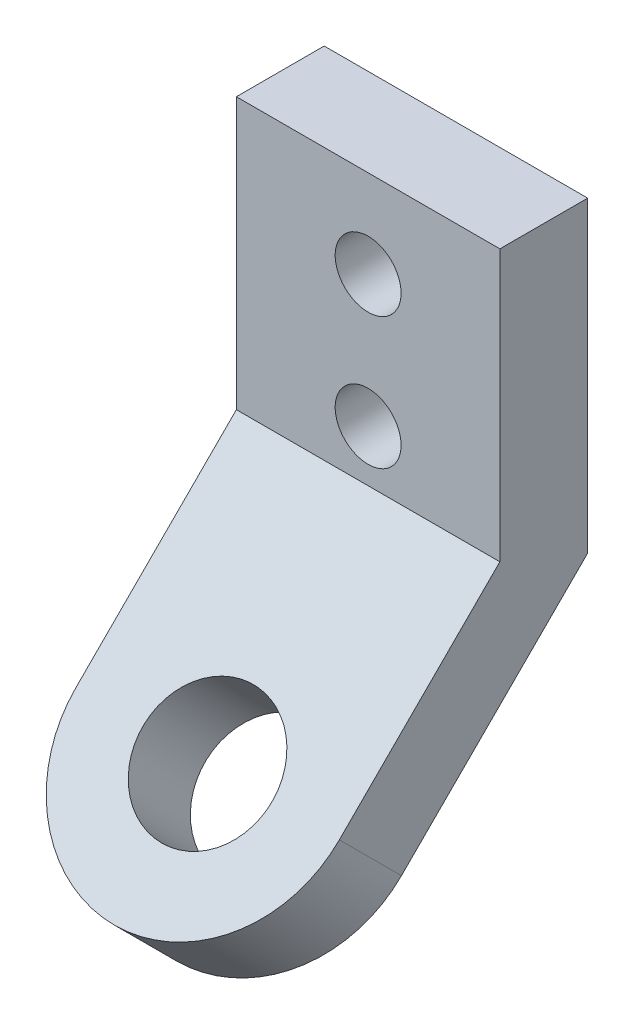
ISO-10303-21;
HEADER;
FILE_DESCRIPTION(('STEP AP214'),'2;1');
FILE_NAME('part.step','',(''),(''),'','','');
FILE_SCHEMA(('AUTOMOTIVE_DESIGN { 1 0 10303 214 1 1 1 1 }'));
ENDSEC;
DATA;
#1=APPLICATION_CONTEXT('core data for automotive mechanical design processes');
#2=APPLICATION_PROTOCOL_DEFINITION('international standard','automotive_design',2000,#1);
#3=PRODUCT_CONTEXT('',#1,'mechanical');
#4=PRODUCT('Part','Part','',(#3));
#5=PRODUCT_RELATED_PRODUCT_CATEGORY('part','',(#4));
#6=PRODUCT_DEFINITION_FORMATION('','',#4);
#7=PRODUCT_DEFINITION_CONTEXT('part definition',#1,'design');
#8=PRODUCT_DEFINITION('design','',#6,#7);
#9=PRODUCT_DEFINITION_SHAPE('','',#8);
#10=(LENGTH_UNIT() NAMED_UNIT(*) SI_UNIT(.MILLI.,.METRE.));
#11=(NAMED_UNIT(*) PLANE_ANGLE_UNIT() SI_UNIT($,.RADIAN.));
#12=(NAMED_UNIT(*) SI_UNIT($,.STERADIAN.) SOLID_ANGLE_UNIT());
#13=UNCERTAINTY_MEASURE_WITH_UNIT(LENGTH_MEASURE(1.E-05),#10,'distance_accuracy_value','');
#14=(GEOMETRIC_REPRESENTATION_CONTEXT(3) GLOBAL_UNCERTAINTY_ASSIGNED_CONTEXT((#13)) GLOBAL_UNIT_ASSIGNED_CONTEXT((#10,
#11,#12)) REPRESENTATION_CONTEXT('',''));
#15=CARTESIAN_POINT('',(0.,0.,0.));
#16=DIRECTION('',(0.,0.,1.));
#17=DIRECTION('',(1.,0.,0.));
#18=AXIS2_PLACEMENT_3D('',#15,#16,#17);
#19=CARTESIAN_POINT('',(76.2,-161.616360533993,161.616360533994));
#20=DIRECTION('',(0.,0.707106781186549,0.707106781186546));
#21=DIRECTION('',(0.,-0.707106781186546,0.707106781186549));
#22=AXIS2_PLACEMENT_3D('',#19,#20,#21);
#23=PLANE('',#22);
#24=DIRECTION('',(0.,0.707106781186546,-0.707106781186549));
#25=VECTOR('',#24,1.);
#26=CARTESIAN_POINT('',(-76.2,-161.616360533993,161.616360533994));
#27=LINE('',#26,#25);
#28=CARTESIAN_POINT('',(-76.2,-107.734823807578,107.734823807579));
#29=VERTEX_POINT('',#28);
#30=CARTESIAN_POINT('',(-76.2,0.,0.));
#31=VERTEX_POINT('',#30);
#32=EDGE_CURVE('E125',#29,#31,#27,.T.);
#33=ORIENTED_EDGE('',*,*,#32,.T.);
#34=DIRECTION('',(-1.,0.,0.));
#35=VECTOR('',#34,1.);
#36=CARTESIAN_POINT('',(76.2,0.,0.));
#37=LINE('',#36,#35);
#38=CARTESIAN_POINT('',(76.2,0.,0.));
#39=VERTEX_POINT('',#38);
#40=EDGE_CURVE('E163',#39,#31,#37,.T.);
#41=ORIENTED_EDGE('',*,*,#40,.F.);
#42=DIRECTION('',(0.,0.707106781186546,-0.707106781186549));
#43=VECTOR('',#42,1.);
#44=CARTESIAN_POINT('',(76.2,-161.616360533993,161.616360533994));
#45=LINE('',#44,#43);
#46=CARTESIAN_POINT('',(76.2,-107.734823807578,107.734823807579));
#47=VERTEX_POINT('',#46);
#48=EDGE_CURVE('E150',#47,#39,#45,.T.);
#49=ORIENTED_EDGE('',*,*,#48,.F.);
#50=CARTESIAN_POINT('',(0.,-107.734823807578,107.734823807579));
#51=DIRECTION('',(0.,0.707106781186549,0.707106781186546));
#52=DIRECTION('',(0.,-0.707106781186546,0.707106781186549));
#53=AXIS2_PLACEMENT_3D('',#50,#51,#52);
#54=CIRCLE('',#53,76.2);
#55=EDGE_CURVE('E145',#29,#47,#54,.T.);
#56=ORIENTED_EDGE('',*,*,#55,.F.);
#57=EDGE_LOOP('',(#33,#41,#49,#56));
#58=FACE_BOUND('',#57,.T.);
#59=CARTESIAN_POINT('',(0.,-107.734823807578,107.734823807579));
#60=DIRECTION('',(0.,0.707106781186549,0.707106781186546));
#61=DIRECTION('',(0.,-0.707106781186546,0.707106781186549));
#62=AXIS2_PLACEMENT_3D('',#59,#60,#61);
#63=CIRCLE('',#62,37.465);
#64=CARTESIAN_POINT('',(0.,-134.226579364732,134.226579364733));
#65=VERTEX_POINT('',#64);
#66=EDGE_CURVE('E147',#65,#65,#63,.T.);
#67=ORIENTED_EDGE('',*,*,#66,.T.);
#68=EDGE_LOOP('',(#67));
#69=FACE_BOUND('',#68,.T.);
#70=ADVANCED_FACE('F54',(#58,#69),#23,.F.);
#71=CARTESIAN_POINT('',(76.2,21.0420489685534,50.8));
#72=DIRECTION('',(0.,-0.707106781186549,-0.707106781186546));
#73=DIRECTION('',(0.,0.707106781186546,-0.707106781186549));
#74=AXIS2_PLACEMENT_3D('',#71,#72,#73);
#75=PLANE('',#74);
#76=CARTESIAN_POINT('',(0.,-71.8137993233015,143.655848291855));
#77=DIRECTION('',(0.,0.707106781186549,0.707106781186546));
#78=DIRECTION('',(0.,-0.707106781186546,0.707106781186549));
#79=AXIS2_PLACEMENT_3D('',#76,#77,#78);
#80=CIRCLE('',#79,37.465);
#81=CARTESIAN_POINT('',(0.,-98.3055548804554,170.147603849009));
#82=VERTEX_POINT('',#81);
#83=EDGE_CURVE('E116',#82,#82,#80,.T.);
#84=ORIENTED_EDGE('',*,*,#83,.F.);
#85=EDGE_LOOP('',(#84));
#86=FACE_BOUND('',#85,.T.);
#87=DIRECTION('',(-1.,0.,0.));
#88=VECTOR('',#87,1.);
#89=CARTESIAN_POINT('',(76.2,21.0420489685534,50.8));
#90=LINE('',#89,#88);
#91=CARTESIAN_POINT('',(76.2,21.0420489685534,50.8));
#92=VERTEX_POINT('',#91);
#93=CARTESIAN_POINT('',(-76.2,21.0420489685534,50.8));
#94=VERTEX_POINT('',#93);
#95=EDGE_CURVE('E128',#92,#94,#90,.T.);
#96=ORIENTED_EDGE('',*,*,#95,.T.);
#97=DIRECTION('',(0.,-0.707106781186546,0.707106781186549));
#98=VECTOR('',#97,1.);
#99=CARTESIAN_POINT('',(-76.2,21.0420489685534,50.8));
#100=LINE('',#99,#98);
#101=CARTESIAN_POINT('',(-76.2,-71.8137993233015,143.655848291855));
#102=VERTEX_POINT('',#101);
#103=EDGE_CURVE('E122',#94,#102,#100,.T.);
#104=ORIENTED_EDGE('',*,*,#103,.T.);
#105=CARTESIAN_POINT('',(0.,-71.8137993233015,143.655848291855));
#106=DIRECTION('',(0.,0.707106781186549,0.707106781186546));
#107=DIRECTION('',(0.,-0.707106781186546,0.707106781186549));
#108=AXIS2_PLACEMENT_3D('',#105,#106,#107);
#109=CIRCLE('',#108,76.2);
#110=CARTESIAN_POINT('',(76.2,-71.8137993233015,143.655848291855));
#111=VERTEX_POINT('',#110);
#112=EDGE_CURVE('E106',#102,#111,#109,.T.);
#113=ORIENTED_EDGE('',*,*,#112,.T.);
#114=DIRECTION('',(0.,-0.707106781186546,0.707106781186549));
#115=VECTOR('',#114,1.);
#116=CARTESIAN_POINT('',(76.2,21.0420489685534,50.8));
#117=LINE('',#116,#115);
#118=EDGE_CURVE('E156',#92,#111,#117,.T.);
#119=ORIENTED_EDGE('',*,*,#118,.F.);
#120=EDGE_LOOP('',(#96,#104,#113,#119));
#121=FACE_BOUND('',#120,.T.);
#122=ADVANCED_FACE('F127',(#86,#121),#75,.F.);
#123=CARTESIAN_POINT('',(76.2,0.,0.));
#124=DIRECTION('',(0.,0.,1.));
#125=DIRECTION('',(1.,0.,0.));
#126=AXIS2_PLACEMENT_3D('',#123,#124,#125);
#127=PLANE('',#126);
#128=DIRECTION('',(0.,1.,0.));
#129=VECTOR('',#128,1.);
#130=CARTESIAN_POINT('',(-76.2,0.,0.));
#131=LINE('',#130,#129);
#132=CARTESIAN_POINT('',(-76.2,177.8,0.));
#133=VERTEX_POINT('',#132);
#134=EDGE_CURVE('E311',#31,#133,#131,.T.);
#135=ORIENTED_EDGE('',*,*,#134,.T.);
#136=DIRECTION('',(-1.,0.,0.));
#137=VECTOR('',#136,1.);
#138=CARTESIAN_POINT('',(76.2,177.8,0.));
#139=LINE('',#138,#137);
#140=CARTESIAN_POINT('',(76.2,177.8,0.));
#141=VERTEX_POINT('',#140);
#142=EDGE_CURVE('E161',#141,#133,#139,.T.);
#143=ORIENTED_EDGE('',*,*,#142,.F.);
#144=DIRECTION('',(0.,1.,0.));
#145=VECTOR('',#144,1.);
#146=CARTESIAN_POINT('',(76.2,0.,0.));
#147=LINE('',#146,#145);
#148=EDGE_CURVE('E152',#39,#141,#147,.T.);
#149=ORIENTED_EDGE('',*,*,#148,.F.);
#150=ORIENTED_EDGE('',*,*,#40,.T.);
#151=EDGE_LOOP('',(#135,#143,#149,#150));
#152=FACE_BOUND('',#151,.T.);
#153=CARTESIAN_POINT('',(0.,127.,0.));
#154=DIRECTION('',(0.,0.,1.));
#155=DIRECTION('',(1.,0.,0.));
#156=AXIS2_PLACEMENT_3D('',#153,#154,#155);
#157=CIRCLE('',#156,19.05);
#158=CARTESIAN_POINT('',(19.05,127.,0.));
#159=VERTEX_POINT('',#158);
#160=EDGE_CURVE('E134',#159,#159,#157,.T.);
#161=ORIENTED_EDGE('',*,*,#160,.T.);
#162=EDGE_LOOP('',(#161));
#163=FACE_BOUND('',#162,.T.);
#164=CARTESIAN_POINT('',(0.,50.8,0.));
#165=DIRECTION('',(0.,0.,1.));
#166=DIRECTION('',(1.,0.,0.));
#167=AXIS2_PLACEMENT_3D('',#164,#165,#166);
#168=CIRCLE('',#167,19.05);
#169=CARTESIAN_POINT('',(19.05,50.8,0.));
#170=VERTEX_POINT('',#169);
#171=EDGE_CURVE('E130',#170,#170,#168,.T.);
#172=ORIENTED_EDGE('',*,*,#171,.T.);
#173=EDGE_LOOP('',(#172));
#174=FACE_BOUND('',#173,.T.);
#175=ADVANCED_FACE('F178',(#152,#163,#174),#127,.F.);
#176=CARTESIAN_POINT('',(76.2,177.8,0.));
#177=DIRECTION('',(0.,-1.,0.));
#178=DIRECTION('',(0.,0.,-1.));
#179=AXIS2_PLACEMENT_3D('',#176,#177,#178);
#180=PLANE('',#179);
#181=ORIENTED_EDGE('',*,*,#142,.T.);
#182=DIRECTION('',(0.,0.,1.));
#183=VECTOR('',#182,1.);
#184=CARTESIAN_POINT('',(-76.2,177.8,0.));
#185=LINE('',#184,#183);
#186=CARTESIAN_POINT('',(-76.2,177.8,50.8));
#187=VERTEX_POINT('',#186);
#188=EDGE_CURVE('E136',#133,#187,#185,.T.);
#189=ORIENTED_EDGE('',*,*,#188,.T.);
#190=DIRECTION('',(-1.,0.,0.));
#191=VECTOR('',#190,1.);
#192=CARTESIAN_POINT('',(76.2,177.8,50.8));
#193=LINE('',#192,#191);
#194=CARTESIAN_POINT('',(76.2,177.8,50.8));
#195=VERTEX_POINT('',#194);
#196=EDGE_CURVE('E159',#195,#187,#193,.T.);
#197=ORIENTED_EDGE('',*,*,#196,.F.);
#198=DIRECTION('',(0.,0.,1.));
#199=VECTOR('',#198,1.);
#200=CARTESIAN_POINT('',(76.2,177.8,0.));
#201=LINE('',#200,#199);
#202=EDGE_CURVE('E73',#141,#195,#201,.T.);
#203=ORIENTED_EDGE('',*,*,#202,.F.);
#204=EDGE_LOOP('',(#181,#189,#197,#203));
#205=FACE_BOUND('',#204,.T.);
#206=ADVANCED_FACE('F180',(#205),#180,.F.);
#207=CARTESIAN_POINT('',(76.2,177.8,50.8));
#208=DIRECTION('',(0.,0.,-1.));
#209=DIRECTION('',(0.,1.,0.));
#210=AXIS2_PLACEMENT_3D('',#207,#208,#209);
#211=PLANE('',#210);
#212=CARTESIAN_POINT('',(0.,127.,50.8));
#213=DIRECTION('',(0.,0.,-1.));
#214=DIRECTION('',(0.,1.,0.));
#215=AXIS2_PLACEMENT_3D('',#212,#213,#214);
#216=CIRCLE('',#215,19.05);
#217=CARTESIAN_POINT('',(19.05,127.,50.8));
#218=VERTEX_POINT('',#217);
#219=EDGE_CURVE('E12',#218,#218,#216,.T.);
#220=ORIENTED_EDGE('',*,*,#219,.T.);
#221=EDGE_LOOP('',(#220));
#222=FACE_BOUND('',#221,.T.);
#223=CARTESIAN_POINT('',(0.,50.8,50.8));
#224=DIRECTION('',(0.,0.,-1.));
#225=DIRECTION('',(0.,1.,0.));
#226=AXIS2_PLACEMENT_3D('',#223,#224,#225);
#227=CIRCLE('',#226,19.05);
#228=CARTESIAN_POINT('',(19.05,50.8,50.8));
#229=VERTEX_POINT('',#228);
#230=EDGE_CURVE('E61',#229,#229,#227,.T.);
#231=ORIENTED_EDGE('',*,*,#230,.T.);
#232=EDGE_LOOP('',(#231));
#233=FACE_BOUND('',#232,.T.);
#234=ORIENTED_EDGE('',*,*,#196,.T.);
#235=DIRECTION('',(0.,-1.,0.));
#236=VECTOR('',#235,1.);
#237=CARTESIAN_POINT('',(-76.2,177.8,50.8));
#238=LINE('',#237,#236);
#239=EDGE_CURVE('E131',#187,#94,#238,.T.);
#240=ORIENTED_EDGE('',*,*,#239,.T.);
#241=ORIENTED_EDGE('',*,*,#95,.F.);
#242=DIRECTION('',(0.,-1.,0.));
#243=VECTOR('',#242,1.);
#244=CARTESIAN_POINT('',(76.2,177.8,50.8));
#245=LINE('',#244,#243);
#246=EDGE_CURVE('E68',#195,#92,#245,.T.);
#247=ORIENTED_EDGE('',*,*,#246,.F.);
#248=EDGE_LOOP('',(#234,#240,#241,#247));
#249=FACE_BOUND('',#248,.T.);
#250=ADVANCED_FACE('F167',(#222,#233,#249),#211,.F.);
#251=CARTESIAN_POINT('',(76.2,0.,0.));
#252=DIRECTION('',(1.,0.,0.));
#253=DIRECTION('',(0.,0.,-1.));
#254=AXIS2_PLACEMENT_3D('',#251,#252,#253);
#255=PLANE('',#254);
#256=DIRECTION('',(0.,0.707106781186549,0.707106781186546));
#257=VECTOR('',#256,1.);
#258=CARTESIAN_POINT('',(76.2,-188.543004074575,26.9266435405821));
#259=LINE('',#258,#257);
#260=EDGE_CURVE('E112',#47,#111,#259,.T.);
#261=ORIENTED_EDGE('',*,*,#260,.F.);
#262=ORIENTED_EDGE('',*,*,#48,.T.);
#263=ORIENTED_EDGE('',*,*,#148,.T.);
#264=ORIENTED_EDGE('',*,*,#202,.T.);
#265=ORIENTED_EDGE('',*,*,#246,.T.);
#266=ORIENTED_EDGE('',*,*,#118,.T.);
#267=EDGE_LOOP('',(#261,#262,#263,#264,#265,#266));
#268=FACE_BOUND('',#267,.T.);
#269=ADVANCED_FACE('F207',(#268),#255,.T.);
#270=CARTESIAN_POINT('',(0.,-188.543004074575,26.9266435405821));
#271=DIRECTION('',(0.,0.707106781186549,0.707106781186546));
#272=DIRECTION('',(0.,-0.707106781186546,0.707106781186549));
#273=AXIS2_PLACEMENT_3D('',#270,#271,#272);
#274=CYLINDRICAL_SURFACE('',#273,76.2);
#275=ORIENTED_EDGE('',*,*,#55,.T.);
#276=ORIENTED_EDGE('',*,*,#260,.T.);
#277=ORIENTED_EDGE('',*,*,#112,.F.);
#278=DIRECTION('',(0.,0.707106781186549,0.707106781186546));
#279=VECTOR('',#278,1.);
#280=CARTESIAN_POINT('',(-76.2,-188.543004074575,26.9266435405821));
#281=LINE('',#280,#279);
#282=EDGE_CURVE('E109',#29,#102,#281,.T.);
#283=ORIENTED_EDGE('',*,*,#282,.F.);
#284=EDGE_LOOP('',(#275,#276,#277,#283));
#285=FACE_BOUND('',#284,.T.);
#286=ADVANCED_FACE('F108',(#285),#274,.T.);
#287=CARTESIAN_POINT('',(0.,-188.543004074575,26.9266435405821));
#288=DIRECTION('',(0.,0.707106781186549,0.707106781186546));
#289=DIRECTION('',(0.,-0.707106781186546,0.707106781186549));
#290=AXIS2_PLACEMENT_3D('',#287,#288,#289);
#291=CYLINDRICAL_SURFACE('',#290,37.465);
#292=ORIENTED_EDGE('',*,*,#83,.T.);
#293=EDGE_LOOP('',(#292));
#294=FACE_BOUND('',#293,.T.);
#295=ORIENTED_EDGE('',*,*,#66,.F.);
#296=EDGE_LOOP('',(#295));
#297=FACE_BOUND('',#296,.T.);
#298=ADVANCED_FACE('F174',(#294,#297),#291,.F.);
#299=CARTESIAN_POINT('',(0.,50.8,0.));
#300=DIRECTION('',(0.,0.,1.));
#301=DIRECTION('',(1.,0.,0.));
#302=AXIS2_PLACEMENT_3D('',#299,#300,#301);
#303=CYLINDRICAL_SURFACE('',#302,19.05);
#304=CARTESIAN_POINT('',(19.05,50.8,50.8));
#305=CARTESIAN_POINT('',(19.05,50.8,50.2708333333333));
#306=CARTESIAN_POINT('',(19.05,50.8,49.7416666666667));
#307=CARTESIAN_POINT('',(19.05,50.8,48.6833333333333));
#308=CARTESIAN_POINT('',(19.05,50.8,48.1541666666667));
#309=CARTESIAN_POINT('',(19.05,50.8,47.0958333333333));
#310=CARTESIAN_POINT('',(19.05,50.8,46.5666666666667));
#311=CARTESIAN_POINT('',(19.05,50.8,45.5083333333333));
#312=CARTESIAN_POINT('',(19.05,50.8,44.9791666666667));
#313=CARTESIAN_POINT('',(19.05,50.8,43.9208333333333));
#314=CARTESIAN_POINT('',(19.05,50.8,43.3916666666667));
#315=CARTESIAN_POINT('',(19.05,50.8,42.3333333333333));
#316=CARTESIAN_POINT('',(19.05,50.8,41.8041666666667));
#317=CARTESIAN_POINT('',(19.05,50.8,40.7458333333333));
#318=CARTESIAN_POINT('',(19.05,50.8,40.2166666666667));
#319=CARTESIAN_POINT('',(19.05,50.8,39.1583333333333));
#320=CARTESIAN_POINT('',(19.05,50.8,38.6291666666667));
#321=CARTESIAN_POINT('',(19.05,50.8,37.5708333333333));
#322=CARTESIAN_POINT('',(19.05,50.8,37.0416666666667));
#323=CARTESIAN_POINT('',(19.05,50.8,35.9833333333333));
#324=CARTESIAN_POINT('',(19.05,50.8,35.4541666666667));
#325=CARTESIAN_POINT('',(19.05,50.8,34.3958333333333));
#326=CARTESIAN_POINT('',(19.05,50.8,33.8666666666667));
#327=CARTESIAN_POINT('',(19.05,50.8,32.8083333333333));
#328=CARTESIAN_POINT('',(19.05,50.8,32.2791666666667));
#329=CARTESIAN_POINT('',(19.05,50.8,31.2208333333333));
#330=CARTESIAN_POINT('',(19.05,50.8,30.6916666666667));
#331=CARTESIAN_POINT('',(19.05,50.8,29.6333333333333));
#332=CARTESIAN_POINT('',(19.05,50.8,29.1041666666667));
#333=CARTESIAN_POINT('',(19.05,50.8,28.0458333333333));
#334=CARTESIAN_POINT('',(19.05,50.8,27.5166666666667));
#335=CARTESIAN_POINT('',(19.05,50.8,26.4583333333333));
#336=CARTESIAN_POINT('',(19.05,50.8,25.9291666666667));
#337=CARTESIAN_POINT('',(19.05,50.8,24.8708333333333));
#338=CARTESIAN_POINT('',(19.05,50.8,24.3416666666667));
#339=CARTESIAN_POINT('',(19.05,50.8,23.2833333333333));
#340=CARTESIAN_POINT('',(19.05,50.8,22.7541666666667));
#341=CARTESIAN_POINT('',(19.05,50.8,21.6958333333333));
#342=CARTESIAN_POINT('',(19.05,50.8,21.1666666666667));
#343=CARTESIAN_POINT('',(19.05,50.8,20.1083333333333));
#344=CARTESIAN_POINT('',(19.05,50.8,19.5791666666667));
#345=CARTESIAN_POINT('',(19.05,50.8,18.5208333333333));
#346=CARTESIAN_POINT('',(19.05,50.8,17.9916666666667));
#347=CARTESIAN_POINT('',(19.05,50.8,16.9333333333333));
#348=CARTESIAN_POINT('',(19.05,50.8,16.4041666666667));
#349=CARTESIAN_POINT('',(19.05,50.8,15.3458333333333));
#350=CARTESIAN_POINT('',(19.05,50.8,14.8166666666667));
#351=CARTESIAN_POINT('',(19.05,50.8,13.7583333333333));
#352=CARTESIAN_POINT('',(19.05,50.8,13.2291666666667));
#353=CARTESIAN_POINT('',(19.05,50.8,12.1708333333333));
#354=CARTESIAN_POINT('',(19.05,50.8,11.6416666666667));
#355=CARTESIAN_POINT('',(19.05,50.8,10.5833333333333));
#356=CARTESIAN_POINT('',(19.05,50.8,10.0541666666667));
#357=CARTESIAN_POINT('',(19.05,50.8,8.99583333333333));
#358=CARTESIAN_POINT('',(19.05,50.8,8.46666666666666));
#359=CARTESIAN_POINT('',(19.05,50.8,7.40833333333333));
#360=CARTESIAN_POINT('',(19.05,50.8,6.87916666666667));
#361=CARTESIAN_POINT('',(19.05,50.8,5.82083333333333));
#362=CARTESIAN_POINT('',(19.05,50.8,5.29166666666667));
#363=CARTESIAN_POINT('',(19.05,50.8,4.23333333333333));
#364=CARTESIAN_POINT('',(19.05,50.8,3.70416666666667));
#365=CARTESIAN_POINT('',(19.05,50.8,2.64583333333333));
#366=CARTESIAN_POINT('',(19.05,50.8,2.11666666666666));
#367=CARTESIAN_POINT('',(19.05,50.8,1.05833333333333));
#368=CARTESIAN_POINT('',(19.05,50.8,0.529166666666666));
#369=CARTESIAN_POINT('',(19.05,50.8,0.));
#370=B_SPLINE_CURVE_WITH_KNOTS('',3,(#304,#305,#306,#307,#308,#309,#310,#311,#312,#313,#314,
#315,#316,#317,#318,#319,#320,#321,#322,#323,#324,#325,#326,#327,#328,#329,#330,#331,#332,#333,
#334,#335,#336,#337,#338,#339,#340,#341,#342,#343,#344,#345,#346,#347,#348,#349,#350,#351,#352,
#353,#354,#355,#356,#357,#358,#359,#360,#361,#362,#363,#364,#365,#366,#367,#368,#369),
.UNSPECIFIED.,.F.,.F.,(4,2,2,2,2,2,2,2,2,2,2,2,2,2,2,2,2,2,2,2,2,2,2,2,2,2,2,2,2,2,2,2,4),(0.,
1.5875,3.175,4.7625,6.35,7.9375,9.525,11.1125,12.7,14.2875,15.875,17.4625,19.05,20.6375,22.225,
23.8125,25.4,26.9875,28.575,30.1625,31.75,33.3375,34.925,36.5125,38.1,39.6875,41.275,42.8625,
44.45,46.0375,47.625,49.2125,50.8),.UNSPECIFIED.);
#371=EDGE_CURVE('BSEAM170',#229,#170,#370,.T.);
#372=ORIENTED_EDGE('',*,*,#230,.F.);
#373=ORIENTED_EDGE('',*,*,#171,.F.);
#374=ORIENTED_EDGE('',*,*,#371,.T.);
#375=ORIENTED_EDGE('',*,*,#371,.F.);
#376=EDGE_LOOP('',(#372,#374,#373,#375));
#377=FACE_BOUND('',#376,.T.);
#378=ADVANCED_FACE('F170',(#377),#303,.F.);
#379=CARTESIAN_POINT('',(0.,127.,0.));
#380=DIRECTION('',(0.,0.,1.));
#381=DIRECTION('',(1.,0.,0.));
#382=AXIS2_PLACEMENT_3D('',#379,#380,#381);
#383=CYLINDRICAL_SURFACE('',#382,19.05);
#384=CARTESIAN_POINT('',(19.05,127.,50.8));
#385=CARTESIAN_POINT('',(19.05,127.,50.2708333333333));
#386=CARTESIAN_POINT('',(19.05,127.,49.7416666666667));
#387=CARTESIAN_POINT('',(19.05,127.,48.6833333333333));
#388=CARTESIAN_POINT('',(19.05,127.,48.1541666666667));
#389=CARTESIAN_POINT('',(19.05,127.,47.0958333333333));
#390=CARTESIAN_POINT('',(19.05,127.,46.5666666666667));
#391=CARTESIAN_POINT('',(19.05,127.,45.5083333333333));
#392=CARTESIAN_POINT('',(19.05,127.,44.9791666666667));
#393=CARTESIAN_POINT('',(19.05,127.,43.9208333333333));
#394=CARTESIAN_POINT('',(19.05,127.,43.3916666666667));
#395=CARTESIAN_POINT('',(19.05,127.,42.3333333333333));
#396=CARTESIAN_POINT('',(19.05,127.,41.8041666666667));
#397=CARTESIAN_POINT('',(19.05,127.,40.7458333333333));
#398=CARTESIAN_POINT('',(19.05,127.,40.2166666666667));
#399=CARTESIAN_POINT('',(19.05,127.,39.1583333333333));
#400=CARTESIAN_POINT('',(19.05,127.,38.6291666666667));
#401=CARTESIAN_POINT('',(19.05,127.,37.5708333333333));
#402=CARTESIAN_POINT('',(19.05,127.,37.0416666666667));
#403=CARTESIAN_POINT('',(19.05,127.,35.9833333333333));
#404=CARTESIAN_POINT('',(19.05,127.,35.4541666666667));
#405=CARTESIAN_POINT('',(19.05,127.,34.3958333333333));
#406=CARTESIAN_POINT('',(19.05,127.,33.8666666666667));
#407=CARTESIAN_POINT('',(19.05,127.,32.8083333333333));
#408=CARTESIAN_POINT('',(19.05,127.,32.2791666666667));
#409=CARTESIAN_POINT('',(19.05,127.,31.2208333333333));
#410=CARTESIAN_POINT('',(19.05,127.,30.6916666666667));
#411=CARTESIAN_POINT('',(19.05,127.,29.6333333333333));
#412=CARTESIAN_POINT('',(19.05,127.,29.1041666666667));
#413=CARTESIAN_POINT('',(19.05,127.,28.0458333333333));
#414=CARTESIAN_POINT('',(19.05,127.,27.5166666666667));
#415=CARTESIAN_POINT('',(19.05,127.,26.4583333333333));
#416=CARTESIAN_POINT('',(19.05,127.,25.9291666666667));
#417=CARTESIAN_POINT('',(19.05,127.,24.8708333333333));
#418=CARTESIAN_POINT('',(19.05,127.,24.3416666666667));
#419=CARTESIAN_POINT('',(19.05,127.,23.2833333333333));
#420=CARTESIAN_POINT('',(19.05,127.,22.7541666666667));
#421=CARTESIAN_POINT('',(19.05,127.,21.6958333333333));
#422=CARTESIAN_POINT('',(19.05,127.,21.1666666666667));
#423=CARTESIAN_POINT('',(19.05,127.,20.1083333333333));
#424=CARTESIAN_POINT('',(19.05,127.,19.5791666666667));
#425=CARTESIAN_POINT('',(19.05,127.,18.5208333333333));
#426=CARTESIAN_POINT('',(19.05,127.,17.9916666666667));
#427=CARTESIAN_POINT('',(19.05,127.,16.9333333333333));
#428=CARTESIAN_POINT('',(19.05,127.,16.4041666666667));
#429=CARTESIAN_POINT('',(19.05,127.,15.3458333333333));
#430=CARTESIAN_POINT('',(19.05,127.,14.8166666666667));
#431=CARTESIAN_POINT('',(19.05,127.,13.7583333333333));
#432=CARTESIAN_POINT('',(19.05,127.,13.2291666666667));
#433=CARTESIAN_POINT('',(19.05,127.,12.1708333333333));
#434=CARTESIAN_POINT('',(19.05,127.,11.6416666666667));
#435=CARTESIAN_POINT('',(19.05,127.,10.5833333333333));
#436=CARTESIAN_POINT('',(19.05,127.,10.0541666666667));
#437=CARTESIAN_POINT('',(19.05,127.,8.99583333333333));
#438=CARTESIAN_POINT('',(19.05,127.,8.46666666666666));
#439=CARTESIAN_POINT('',(19.05,127.,7.40833333333333));
#440=CARTESIAN_POINT('',(19.05,127.,6.87916666666667));
#441=CARTESIAN_POINT('',(19.05,127.,5.82083333333333));
#442=CARTESIAN_POINT('',(19.05,127.,5.29166666666667));
#443=CARTESIAN_POINT('',(19.05,127.,4.23333333333333));
#444=CARTESIAN_POINT('',(19.05,127.,3.70416666666667));
#445=CARTESIAN_POINT('',(19.05,127.,2.64583333333333));
#446=CARTESIAN_POINT('',(19.05,127.,2.11666666666666));
#447=CARTESIAN_POINT('',(19.05,127.,1.05833333333333));
#448=CARTESIAN_POINT('',(19.05,127.,0.529166666666666));
#449=CARTESIAN_POINT('',(19.05,127.,0.));
#450=B_SPLINE_CURVE_WITH_KNOTS('',3,(#384,#385,#386,#387,#388,#389,#390,#391,#392,#393,#394,
#395,#396,#397,#398,#399,#400,#401,#402,#403,#404,#405,#406,#407,#408,#409,#410,#411,#412,#413,
#414,#415,#416,#417,#418,#419,#420,#421,#422,#423,#424,#425,#426,#427,#428,#429,#430,#431,#432,
#433,#434,#435,#436,#437,#438,#439,#440,#441,#442,#443,#444,#445,#446,#447,#448,#449),
.UNSPECIFIED.,.F.,.F.,(4,2,2,2,2,2,2,2,2,2,2,2,2,2,2,2,2,2,2,2,2,2,2,2,2,2,2,2,2,2,2,2,4),(0.,
1.5875,3.175,4.7625,6.35,7.9375,9.525,11.1125,12.7,14.2875,15.875,17.4625,19.05,20.6375,22.225,
23.8125,25.4,26.9875,28.575,30.1625,31.75,33.3375,34.925,36.5125,38.1,39.6875,41.275,42.8625,
44.45,46.0375,47.625,49.2125,50.8),.UNSPECIFIED.);
#451=EDGE_CURVE('BSEAM173',#218,#159,#450,.T.);
#452=ORIENTED_EDGE('',*,*,#219,.F.);
#453=ORIENTED_EDGE('',*,*,#160,.F.);
#454=ORIENTED_EDGE('',*,*,#451,.T.);
#455=ORIENTED_EDGE('',*,*,#451,.F.);
#456=EDGE_LOOP('',(#452,#454,#453,#455));
#457=FACE_BOUND('',#456,.T.);
#458=ADVANCED_FACE('F173',(#457),#383,.F.);
#459=CARTESIAN_POINT('',(-76.2,0.,0.));
#460=DIRECTION('',(-1.,0.,0.));
#461=DIRECTION('',(0.,0.,-1.));
#462=AXIS2_PLACEMENT_3D('',#459,#460,#461);
#463=PLANE('',#462);
#464=ORIENTED_EDGE('',*,*,#282,.T.);
#465=ORIENTED_EDGE('',*,*,#103,.F.);
#466=ORIENTED_EDGE('',*,*,#239,.F.);
#467=ORIENTED_EDGE('',*,*,#188,.F.);
#468=ORIENTED_EDGE('',*,*,#134,.F.);
#469=ORIENTED_EDGE('',*,*,#32,.F.);
#470=EDGE_LOOP('',(#464,#465,#466,#467,#468,#469));
#471=FACE_BOUND('',#470,.T.);
#472=ADVANCED_FACE('F120',(#471),#463,.T.);
#473=CLOSED_SHELL('',(#70,#122,#175,#206,#250,#269,#286,#298,#378,#458,#472));
#474=MANIFOLD_SOLID_BREP('B2',#473);
#475=ADVANCED_BREP_SHAPE_REPRESENTATION('',(#18,#474),#14);
#476=SHAPE_DEFINITION_REPRESENTATION(#9,#475);
ENDSEC;
END-ISO-10303-21;
